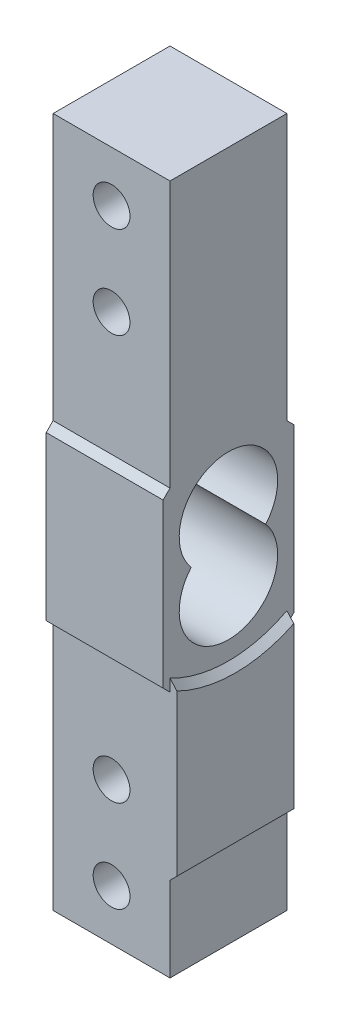
ISO-10303-21;
HEADER;
FILE_DESCRIPTION(('STEP AP214'),'2;1');
FILE_NAME('part.step','',(''),(''),'','','');
FILE_SCHEMA(('AUTOMOTIVE_DESIGN { 1 0 10303 214 1 1 1 1 }'));
ENDSEC;
DATA;
#1=APPLICATION_CONTEXT('core data for automotive mechanical design processes');
#2=APPLICATION_PROTOCOL_DEFINITION('international standard','automotive_design',2000,#1);
#3=PRODUCT_CONTEXT('',#1,'mechanical');
#4=PRODUCT('Part','Part','',(#3));
#5=PRODUCT_RELATED_PRODUCT_CATEGORY('part','',(#4));
#6=PRODUCT_DEFINITION_FORMATION('','',#4);
#7=PRODUCT_DEFINITION_CONTEXT('part definition',#1,'design');
#8=PRODUCT_DEFINITION('design','',#6,#7);
#9=PRODUCT_DEFINITION_SHAPE('','',#8);
#10=(LENGTH_UNIT() NAMED_UNIT(*) SI_UNIT(.MILLI.,.METRE.));
#11=(NAMED_UNIT(*) PLANE_ANGLE_UNIT() SI_UNIT($,.RADIAN.));
#12=(NAMED_UNIT(*) SI_UNIT($,.STERADIAN.) SOLID_ANGLE_UNIT());
#13=UNCERTAINTY_MEASURE_WITH_UNIT(LENGTH_MEASURE(1.E-05),#10,'distance_accuracy_value','');
#14=(GEOMETRIC_REPRESENTATION_CONTEXT(3) GLOBAL_UNCERTAINTY_ASSIGNED_CONTEXT((#13)) GLOBAL_UNIT_ASSIGNED_CONTEXT((#10,
#11,#12)) REPRESENTATION_CONTEXT('',''));
#15=CARTESIAN_POINT('',(0.,0.,0.));
#16=DIRECTION('',(0.,0.,1.));
#17=DIRECTION('',(1.,0.,0.));
#18=AXIS2_PLACEMENT_3D('',#15,#16,#17);
#19=CARTESIAN_POINT('',(6.35,37.5,6.35));
#20=DIRECTION('',(-1.,0.,0.));
#21=DIRECTION('',(0.,0.,1.));
#22=AXIS2_PLACEMENT_3D('',#19,#20,#21);
#23=PLANE('',#22);
#24=DIRECTION('',(0.,-1.,0.));
#25=VECTOR('',#24,1.);
#26=CARTESIAN_POINT('',(6.35,37.5,-6.35));
#27=LINE('',#26,#25);
#28=CARTESIAN_POINT('',(6.35,-28.3,-6.35));
#29=VERTEX_POINT('',#28);
#30=CARTESIAN_POINT('',(6.35,-37.5,-6.35));
#31=VERTEX_POINT('',#30);
#32=EDGE_CURVE('E220',#29,#31,#27,.T.);
#33=ORIENTED_EDGE('',*,*,#32,.F.);
#34=DIRECTION('',(0.,0.,1.));
#35=VECTOR('',#34,1.);
#36=CARTESIAN_POINT('',(6.35,-28.3,6.35));
#37=LINE('',#36,#35);
#38=CARTESIAN_POINT('',(6.35,-28.3,6.35));
#39=VERTEX_POINT('',#38);
#40=EDGE_CURVE('E276',#29,#39,#37,.T.);
#41=ORIENTED_EDGE('',*,*,#40,.T.);
#42=DIRECTION('',(0.,-1.,0.));
#43=VECTOR('',#42,1.);
#44=CARTESIAN_POINT('',(6.35,37.5,6.35));
#45=LINE('',#44,#43);
#46=CARTESIAN_POINT('',(6.35,-37.5,6.35));
#47=VERTEX_POINT('',#46);
#48=EDGE_CURVE('E200',#39,#47,#45,.T.);
#49=ORIENTED_EDGE('',*,*,#48,.T.);
#50=DIRECTION('',(0.,0.,-1.));
#51=VECTOR('',#50,1.);
#52=CARTESIAN_POINT('',(6.35,-37.5,6.35));
#53=LINE('',#52,#51);
#54=EDGE_CURVE('E169',#47,#31,#53,.T.);
#55=ORIENTED_EDGE('',*,*,#54,.T.);
#56=EDGE_LOOP('',(#33,#41,#49,#55));
#57=FACE_BOUND('',#56,.T.);
#58=ADVANCED_FACE('F35',(#57),#23,.F.);
#59=CARTESIAN_POINT('',(6.35,3.5,0.));
#60=DIRECTION('',(1.,0.,0.));
#61=DIRECTION('',(0.,0.,-1.));
#62=AXIS2_PLACEMENT_3D('',#59,#60,#61);
#63=CIRCLE('',#62,5.35);
#64=CARTESIAN_POINT('',(6.35,0.,-4.04629460123704));
#65=VERTEX_POINT('',#64);
#66=CARTESIAN_POINT('',(6.35,0.,4.04629460123705));
#67=VERTEX_POINT('',#66);
#68=EDGE_CURVE('E173',#65,#67,#63,.T.);
#69=ORIENTED_EDGE('',*,*,#68,.F.);
#70=CARTESIAN_POINT('',(6.35,-3.5,0.));
#71=DIRECTION('',(1.,0.,0.));
#72=DIRECTION('',(0.,0.,1.));
#73=AXIS2_PLACEMENT_3D('',#70,#71,#72);
#74=CIRCLE('',#73,5.35);
#75=EDGE_CURVE('E162',#67,#65,#74,.T.);
#76=ORIENTED_EDGE('',*,*,#75,.F.);
#77=EDGE_LOOP('',(#69,#76));
#78=FACE_BOUND('',#77,.T.);
#79=DIRECTION('',(0.,1.,0.));
#80=VECTOR('',#79,1.);
#81=CARTESIAN_POINT('',(6.35,-7.85000000000001,-6.35));
#82=LINE('',#81,#80);
#83=CARTESIAN_POINT('',(6.35,-10.6,-6.35));
#84=VERTEX_POINT('',#83);
#85=CARTESIAN_POINT('',(6.35,-9.28248998343714,-6.35));
#86=VERTEX_POINT('',#85);
#87=EDGE_CURVE('E222',#84,#86,#82,.T.);
#88=ORIENTED_EDGE('',*,*,#87,.F.);
#89=DIRECTION('',(0.,-0.707106781186551,0.707106781186544));
#90=VECTOR('',#89,1.);
#91=CARTESIAN_POINT('',(6.35,-9.84999999999997,-7.1));
#92=LINE('',#91,#90);
#93=CARTESIAN_POINT('',(6.35,-9.84999999999997,-7.1));
#94=VERTEX_POINT('',#93);
#95=EDGE_CURVE('E309',#84,#94,#92,.F.);
#96=ORIENTED_EDGE('',*,*,#95,.T.);
#97=DIRECTION('',(0.,-1.,0.));
#98=VECTOR('',#97,1.);
#99=CARTESIAN_POINT('',(6.35,37.5,-7.1));
#100=LINE('',#99,#98);
#101=CARTESIAN_POINT('',(6.35,7.84999999999999,-7.1));
#102=VERTEX_POINT('',#101);
#103=EDGE_CURVE('E179',#102,#94,#100,.T.);
#104=ORIENTED_EDGE('',*,*,#103,.F.);
#105=DIRECTION('',(0.,-0.707106781186544,-0.707106781186551));
#106=VECTOR('',#105,1.);
#107=CARTESIAN_POINT('',(6.35,9.85,-5.09999999999996));
#108=LINE('',#107,#106);
#109=CARTESIAN_POINT('',(6.35,8.59999999999998,-6.35));
#110=VERTEX_POINT('',#109);
#111=EDGE_CURVE('E307',#102,#110,#108,.F.);
#112=ORIENTED_EDGE('',*,*,#111,.T.);
#113=CARTESIAN_POINT('',(6.35,37.5,-6.35));
#114=VERTEX_POINT('',#113);
#115=EDGE_CURVE('E54',#114,#110,#27,.T.);
#116=ORIENTED_EDGE('',*,*,#115,.F.);
#117=DIRECTION('',(0.,0.,-1.));
#118=VECTOR('',#117,1.);
#119=CARTESIAN_POINT('',(6.35,37.5,6.35));
#120=LINE('',#119,#118);
#121=CARTESIAN_POINT('',(6.35,37.5,6.35));
#122=VERTEX_POINT('',#121);
#123=EDGE_CURVE('E190',#122,#114,#120,.T.);
#124=ORIENTED_EDGE('',*,*,#123,.F.);
#125=CARTESIAN_POINT('',(6.35,8.59999999999998,6.35));
#126=VERTEX_POINT('',#125);
#127=EDGE_CURVE('E211',#122,#126,#45,.T.);
#128=ORIENTED_EDGE('',*,*,#127,.T.);
#129=DIRECTION('',(0.,0.707106781186552,-0.707106781186544));
#130=VECTOR('',#129,1.);
#131=CARTESIAN_POINT('',(6.35,7.84999999999997,7.1));
#132=LINE('',#131,#130);
#133=CARTESIAN_POINT('',(6.35,7.84999999999997,7.1));
#134=VERTEX_POINT('',#133);
#135=EDGE_CURVE('E305',#126,#134,#132,.F.);
#136=ORIENTED_EDGE('',*,*,#135,.T.);
#137=DIRECTION('',(0.,1.,0.));
#138=VECTOR('',#137,1.);
#139=CARTESIAN_POINT('',(6.35,37.5,7.1));
#140=LINE('',#139,#138);
#141=CARTESIAN_POINT('',(6.35,-9.84999999999999,7.1));
#142=VERTEX_POINT('',#141);
#143=EDGE_CURVE('E360',#142,#134,#140,.T.);
#144=ORIENTED_EDGE('',*,*,#143,.F.);
#145=DIRECTION('',(0.,0.707106781186544,0.707106781186551));
#146=VECTOR('',#145,1.);
#147=CARTESIAN_POINT('',(6.35,-11.85,5.09999999999996));
#148=LINE('',#147,#146);
#149=CARTESIAN_POINT('',(6.35,-10.6,6.35));
#150=VERTEX_POINT('',#149);
#151=EDGE_CURVE('E303',#142,#150,#148,.F.);
#152=ORIENTED_EDGE('',*,*,#151,.T.);
#153=DIRECTION('',(0.,-1.,0.));
#154=VECTOR('',#153,1.);
#155=CARTESIAN_POINT('',(6.35,-7.85000000000001,6.35));
#156=LINE('',#155,#154);
#157=CARTESIAN_POINT('',(6.35,-9.28248998343714,6.34999999999999));
#158=VERTEX_POINT('',#157);
#159=EDGE_CURVE('E349',#158,#150,#156,.T.);
#160=ORIENTED_EDGE('',*,*,#159,.F.);
#161=CARTESIAN_POINT('',(6.35,2.79571428571428,0.));
#162=DIRECTION('',(-1.,0.,0.));
#163=DIRECTION('',(0.,0.,1.));
#164=AXIS2_PLACEMENT_3D('',#161,#162,#163);
#165=CIRCLE('',#164,13.6457142857143);
#166=EDGE_CURVE('E318',#158,#86,#165,.F.);
#167=ORIENTED_EDGE('',*,*,#166,.T.);
#168=EDGE_LOOP('',(#88,#96,#104,#112,#116,#124,#128,#136,#144,#152,#160,#167));
#169=FACE_BOUND('',#168,.T.);
#170=ADVANCED_FACE('F177',(#78,#169),#23,.F.);
#171=CARTESIAN_POINT('',(-6.35,37.5,6.35));
#172=DIRECTION('',(0.,0.,-1.));
#173=DIRECTION('',(-1.,0.,0.));
#174=AXIS2_PLACEMENT_3D('',#171,#172,#173);
#175=PLANE('',#174);
#176=CARTESIAN_POINT('',(0.,32.,6.35));
#177=DIRECTION('',(0.,0.,-1.));
#178=DIRECTION('',(-1.,0.,0.));
#179=AXIS2_PLACEMENT_3D('',#176,#177,#178);
#180=CIRCLE('',#179,2.);
#181=CARTESIAN_POINT('',(2.,32.,6.35));
#182=VERTEX_POINT('',#181);
#183=EDGE_CURVE('E346',#182,#182,#180,.T.);
#184=ORIENTED_EDGE('',*,*,#183,.T.);
#185=EDGE_LOOP('',(#184));
#186=FACE_BOUND('',#185,.T.);
#187=CARTESIAN_POINT('',(0.,22.,6.35));
#188=DIRECTION('',(0.,0.,-1.));
#189=DIRECTION('',(-1.,0.,0.));
#190=AXIS2_PLACEMENT_3D('',#187,#188,#189);
#191=CIRCLE('',#190,2.);
#192=CARTESIAN_POINT('',(2.,22.,6.35));
#193=VERTEX_POINT('',#192);
#194=EDGE_CURVE('E335',#193,#193,#191,.T.);
#195=ORIENTED_EDGE('',*,*,#194,.T.);
#196=EDGE_LOOP('',(#195));
#197=FACE_BOUND('',#196,.T.);
#198=DIRECTION('',(0.,-1.,0.));
#199=VECTOR('',#198,1.);
#200=CARTESIAN_POINT('',(-6.35,37.5,6.35));
#201=LINE('',#200,#199);
#202=CARTESIAN_POINT('',(-6.35,37.5,6.35));
#203=VERTEX_POINT('',#202);
#204=CARTESIAN_POINT('',(-6.35,8.59999999999998,6.35));
#205=VERTEX_POINT('',#204);
#206=EDGE_CURVE('E214',#203,#205,#201,.T.);
#207=ORIENTED_EDGE('',*,*,#206,.T.);
#208=DIRECTION('',(-1.,0.,0.));
#209=VECTOR('',#208,1.);
#210=CARTESIAN_POINT('',(-6.35,8.59999999999998,6.35));
#211=LINE('',#210,#209);
#212=EDGE_CURVE('E46',#205,#126,#211,.F.);
#213=ORIENTED_EDGE('',*,*,#212,.T.);
#214=ORIENTED_EDGE('',*,*,#127,.F.);
#215=DIRECTION('',(1.,0.,0.));
#216=VECTOR('',#215,1.);
#217=CARTESIAN_POINT('',(-6.35,37.5,6.35));
#218=LINE('',#217,#216);
#219=EDGE_CURVE('E198',#203,#122,#218,.T.);
#220=ORIENTED_EDGE('',*,*,#219,.F.);
#221=EDGE_LOOP('',(#207,#213,#214,#220));
#222=FACE_BOUND('',#221,.T.);
#223=ADVANCED_FACE('F405',(#186,#197,#222),#175,.F.);
#224=CARTESIAN_POINT('',(-6.35,37.5,-6.35));
#225=DIRECTION('',(0.,0.,1.));
#226=DIRECTION('',(1.,0.,0.));
#227=AXIS2_PLACEMENT_3D('',#224,#225,#226);
#228=PLANE('',#227);
#229=CARTESIAN_POINT('',(0.,-22.,-6.35));
#230=DIRECTION('',(0.,0.,1.));
#231=DIRECTION('',(1.,0.,0.));
#232=AXIS2_PLACEMENT_3D('',#229,#230,#231);
#233=CIRCLE('',#232,2.);
#234=CARTESIAN_POINT('',(2.,-22.,-6.35));
#235=VERTEX_POINT('',#234);
#236=EDGE_CURVE('E332',#235,#235,#233,.T.);
#237=ORIENTED_EDGE('',*,*,#236,.T.);
#238=EDGE_LOOP('',(#237));
#239=FACE_BOUND('',#238,.T.);
#240=CARTESIAN_POINT('',(0.,-32.,-6.35));
#241=DIRECTION('',(0.,0.,1.));
#242=DIRECTION('',(1.,0.,0.));
#243=AXIS2_PLACEMENT_3D('',#240,#241,#242);
#244=CIRCLE('',#243,2.);
#245=CARTESIAN_POINT('',(2.,-32.,-6.35));
#246=VERTEX_POINT('',#245);
#247=EDGE_CURVE('E329',#246,#246,#244,.T.);
#248=ORIENTED_EDGE('',*,*,#247,.T.);
#249=EDGE_LOOP('',(#248));
#250=FACE_BOUND('',#249,.T.);
#251=DIRECTION('',(-0.707106781186544,-0.707106781186551,0.));
#252=VECTOR('',#251,1.);
#253=CARTESIAN_POINT('',(7.1,-27.55,-6.35));
#254=LINE('',#253,#252);
#255=CARTESIAN_POINT('',(7.1,-27.55,-6.35));
#256=VERTEX_POINT('',#255);
#257=EDGE_CURVE('E237',#256,#29,#254,.T.);
#258=ORIENTED_EDGE('',*,*,#257,.T.);
#259=ORIENTED_EDGE('',*,*,#32,.T.);
#260=DIRECTION('',(-1.,0.,0.));
#261=VECTOR('',#260,1.);
#262=CARTESIAN_POINT('',(-6.35,-37.5,-6.35));
#263=LINE('',#262,#261);
#264=CARTESIAN_POINT('',(-6.35,-37.5,-6.35));
#265=VERTEX_POINT('',#264);
#266=EDGE_CURVE('E203',#31,#265,#263,.T.);
#267=ORIENTED_EDGE('',*,*,#266,.T.);
#268=DIRECTION('',(0.,-1.,0.));
#269=VECTOR('',#268,1.);
#270=CARTESIAN_POINT('',(-6.35,37.5,-6.35));
#271=LINE('',#270,#269);
#272=CARTESIAN_POINT('',(-6.35,-10.6,-6.35));
#273=VERTEX_POINT('',#272);
#274=EDGE_CURVE('E217',#273,#265,#271,.T.);
#275=ORIENTED_EDGE('',*,*,#274,.F.);
#276=DIRECTION('',(-1.,0.,0.));
#277=VECTOR('',#276,1.);
#278=CARTESIAN_POINT('',(-6.35,-10.6,-6.35));
#279=LINE('',#278,#277);
#280=EDGE_CURVE('E320',#273,#84,#279,.F.);
#281=ORIENTED_EDGE('',*,*,#280,.T.);
#282=ORIENTED_EDGE('',*,*,#87,.T.);
#283=CARTESIAN_POINT('',(6.35,-9.28248998343714,-6.35));
#284=CARTESIAN_POINT('',(6.47451875053997,-9.42313890329156,-6.35));
#285=CARTESIAN_POINT('',(6.59927813075226,-9.56357331213953,-6.35));
#286=CARTESIAN_POINT('',(6.84927813082808,-9.84401308573139,-6.35));
#287=CARTESIAN_POINT('',(6.9745187506158,-9.98401845054286,-6.35));
#288=CARTESIAN_POINT('',(7.1,-10.1238093044155,-6.35));
#289=B_SPLINE_CURVE_WITH_KNOTS('',3,(#283,#284,#285,#286,#287,#288),.UNSPECIFIED.,.F.,.F.,(4,2,
4),(0.,0.563542842430718,1.12708559607701),.UNSPECIFIED.);
#290=CARTESIAN_POINT('',(7.1,-10.1238093044155,-6.35));
#291=VERTEX_POINT('',#290);
#292=EDGE_CURVE('E229',#86,#291,#289,.T.);
#293=ORIENTED_EDGE('',*,*,#292,.T.);
#294=DIRECTION('',(0.,1.,0.));
#295=VECTOR('',#294,1.);
#296=CARTESIAN_POINT('',(7.1,-7.85000000000001,-6.35));
#297=LINE('',#296,#295);
#298=EDGE_CURVE('E352',#256,#291,#297,.T.);
#299=ORIENTED_EDGE('',*,*,#298,.F.);
#300=EDGE_LOOP('',(#258,#259,#267,#275,#281,#282,#293,#299));
#301=FACE_BOUND('',#300,.T.);
#302=ADVANCED_FACE('F250',(#239,#250,#301),#228,.F.);
#303=CARTESIAN_POINT('',(0.,32.,-6.35));
#304=DIRECTION('',(0.,0.,1.));
#305=DIRECTION('',(1.,0.,0.));
#306=AXIS2_PLACEMENT_3D('',#303,#304,#305);
#307=CIRCLE('',#306,2.);
#308=CARTESIAN_POINT('',(2.,32.,-6.35));
#309=VERTEX_POINT('',#308);
#310=EDGE_CURVE('E40',#309,#309,#307,.T.);
#311=ORIENTED_EDGE('',*,*,#310,.T.);
#312=EDGE_LOOP('',(#311));
#313=FACE_BOUND('',#312,.T.);
#314=CARTESIAN_POINT('',(0.,22.,-6.35));
#315=DIRECTION('',(0.,0.,1.));
#316=DIRECTION('',(1.,0.,0.));
#317=AXIS2_PLACEMENT_3D('',#314,#315,#316);
#318=CIRCLE('',#317,2.);
#319=CARTESIAN_POINT('',(2.,22.,-6.35));
#320=VERTEX_POINT('',#319);
#321=EDGE_CURVE('E333',#320,#320,#318,.T.);
#322=ORIENTED_EDGE('',*,*,#321,.T.);
#323=EDGE_LOOP('',(#322));
#324=FACE_BOUND('',#323,.T.);
#325=ORIENTED_EDGE('',*,*,#115,.T.);
#326=DIRECTION('',(1.,0.,0.));
#327=VECTOR('',#326,1.);
#328=CARTESIAN_POINT('',(-6.35,8.59999999999998,-6.35));
#329=LINE('',#328,#327);
#330=CARTESIAN_POINT('',(-6.35,8.59999999999998,-6.35));
#331=VERTEX_POINT('',#330);
#332=EDGE_CURVE('E322',#110,#331,#329,.F.);
#333=ORIENTED_EDGE('',*,*,#332,.T.);
#334=CARTESIAN_POINT('',(-6.35,37.5,-6.35));
#335=VERTEX_POINT('',#334);
#336=EDGE_CURVE('E218',#335,#331,#271,.T.);
#337=ORIENTED_EDGE('',*,*,#336,.F.);
#338=DIRECTION('',(-1.,0.,0.));
#339=VECTOR('',#338,1.);
#340=CARTESIAN_POINT('',(-6.35,37.5,-6.35));
#341=LINE('',#340,#339);
#342=EDGE_CURVE('E193',#114,#335,#341,.T.);
#343=ORIENTED_EDGE('',*,*,#342,.F.);
#344=EDGE_LOOP('',(#325,#333,#337,#343));
#345=FACE_BOUND('',#344,.T.);
#346=ADVANCED_FACE('F244',(#313,#324,#345),#228,.F.);
#347=CARTESIAN_POINT('',(-6.35,37.5,6.35));
#348=DIRECTION('',(1.,0.,0.));
#349=DIRECTION('',(0.,0.,-1.));
#350=AXIS2_PLACEMENT_3D('',#347,#348,#349);
#351=PLANE('',#350);
#352=CARTESIAN_POINT('',(-6.35,3.5,0.));
#353=DIRECTION('',(1.,0.,0.));
#354=DIRECTION('',(0.,0.,-1.));
#355=AXIS2_PLACEMENT_3D('',#352,#353,#354);
#356=CIRCLE('',#355,5.35);
#357=CARTESIAN_POINT('',(-6.35,0.,-4.04629460123704));
#358=VERTEX_POINT('',#357);
#359=CARTESIAN_POINT('',(-6.35,0.,4.04629460123705));
#360=VERTEX_POINT('',#359);
#361=EDGE_CURVE('E187',#358,#360,#356,.T.);
#362=ORIENTED_EDGE('',*,*,#361,.T.);
#363=CARTESIAN_POINT('',(-6.35,-3.5,0.));
#364=DIRECTION('',(1.,0.,0.));
#365=DIRECTION('',(0.,0.,1.));
#366=AXIS2_PLACEMENT_3D('',#363,#364,#365);
#367=CIRCLE('',#366,5.35);
#368=EDGE_CURVE('E165',#360,#358,#367,.T.);
#369=ORIENTED_EDGE('',*,*,#368,.T.);
#370=EDGE_LOOP('',(#362,#369));
#371=FACE_BOUND('',#370,.T.);
#372=DIRECTION('',(0.,0.707106781186551,-0.707106781186544));
#373=VECTOR('',#372,1.);
#374=CARTESIAN_POINT('',(-6.35,-9.84999999999997,-7.1));
#375=LINE('',#374,#373);
#376=CARTESIAN_POINT('',(-6.35,-9.84999999999997,-7.1));
#377=VERTEX_POINT('',#376);
#378=EDGE_CURVE('E300',#377,#273,#375,.F.);
#379=ORIENTED_EDGE('',*,*,#378,.T.);
#380=ORIENTED_EDGE('',*,*,#274,.T.);
#381=DIRECTION('',(0.,0.,1.));
#382=VECTOR('',#381,1.);
#383=CARTESIAN_POINT('',(-6.35,-37.5,6.35));
#384=LINE('',#383,#382);
#385=CARTESIAN_POINT('',(-6.35,-37.5,6.35));
#386=VERTEX_POINT('',#385);
#387=EDGE_CURVE('E206',#265,#386,#384,.T.);
#388=ORIENTED_EDGE('',*,*,#387,.T.);
#389=CARTESIAN_POINT('',(-6.35,-10.6,6.35));
#390=VERTEX_POINT('',#389);
#391=EDGE_CURVE('E213',#390,#386,#201,.T.);
#392=ORIENTED_EDGE('',*,*,#391,.F.);
#393=DIRECTION('',(0.,-0.707106781186544,-0.707106781186551));
#394=VECTOR('',#393,1.);
#395=CARTESIAN_POINT('',(-6.35,-11.85,5.09999999999996));
#396=LINE('',#395,#394);
#397=CARTESIAN_POINT('',(-6.35,-9.84999999999999,7.1));
#398=VERTEX_POINT('',#397);
#399=EDGE_CURVE('E293',#390,#398,#396,.F.);
#400=ORIENTED_EDGE('',*,*,#399,.T.);
#401=DIRECTION('',(0.,-1.,0.));
#402=VECTOR('',#401,1.);
#403=CARTESIAN_POINT('',(-6.35,37.5,7.1));
#404=LINE('',#403,#402);
#405=CARTESIAN_POINT('',(-6.35,7.84999999999997,7.1));
#406=VERTEX_POINT('',#405);
#407=EDGE_CURVE('E355',#406,#398,#404,.T.);
#408=ORIENTED_EDGE('',*,*,#407,.F.);
#409=DIRECTION('',(0.,-0.707106781186552,0.707106781186544));
#410=VECTOR('',#409,1.);
#411=CARTESIAN_POINT('',(-6.35,7.84999999999997,7.1));
#412=LINE('',#411,#410);
#413=EDGE_CURVE('E295',#406,#205,#412,.F.);
#414=ORIENTED_EDGE('',*,*,#413,.T.);
#415=ORIENTED_EDGE('',*,*,#206,.F.);
#416=DIRECTION('',(0.,0.,1.));
#417=VECTOR('',#416,1.);
#418=CARTESIAN_POINT('',(-6.35,37.5,6.35));
#419=LINE('',#418,#417);
#420=EDGE_CURVE('E196',#335,#203,#419,.T.);
#421=ORIENTED_EDGE('',*,*,#420,.F.);
#422=ORIENTED_EDGE('',*,*,#336,.T.);
#423=DIRECTION('',(0.,0.707106781186544,0.707106781186551));
#424=VECTOR('',#423,1.);
#425=CARTESIAN_POINT('',(-6.35,9.85,-5.09999999999996));
#426=LINE('',#425,#424);
#427=CARTESIAN_POINT('',(-6.35,7.84999999999999,-7.1));
#428=VERTEX_POINT('',#427);
#429=EDGE_CURVE('E298',#331,#428,#426,.F.);
#430=ORIENTED_EDGE('',*,*,#429,.T.);
#431=DIRECTION('',(0.,1.,0.));
#432=VECTOR('',#431,1.);
#433=CARTESIAN_POINT('',(-6.35,37.5,-7.1));
#434=LINE('',#433,#432);
#435=EDGE_CURVE('E182',#377,#428,#434,.T.);
#436=ORIENTED_EDGE('',*,*,#435,.F.);
#437=EDGE_LOOP('',(#379,#380,#388,#392,#400,#408,#414,#415,#421,#422,#430,#436));
#438=FACE_BOUND('',#437,.T.);
#439=ADVANCED_FACE('F249',(#371,#438),#351,.F.);
#440=CARTESIAN_POINT('',(0.,-22.,6.35));
#441=DIRECTION('',(0.,0.,-1.));
#442=DIRECTION('',(-1.,0.,0.));
#443=AXIS2_PLACEMENT_3D('',#440,#441,#442);
#444=CIRCLE('',#443,2.);
#445=CARTESIAN_POINT('',(2.,-22.,6.35));
#446=VERTEX_POINT('',#445);
#447=EDGE_CURVE('E330',#446,#446,#444,.T.);
#448=ORIENTED_EDGE('',*,*,#447,.T.);
#449=EDGE_LOOP('',(#448));
#450=FACE_BOUND('',#449,.T.);
#451=CARTESIAN_POINT('',(0.,-32.,6.35));
#452=DIRECTION('',(0.,0.,-1.));
#453=DIRECTION('',(-1.,0.,0.));
#454=AXIS2_PLACEMENT_3D('',#451,#452,#453);
#455=CIRCLE('',#454,2.);
#456=CARTESIAN_POINT('',(2.,-32.,6.35));
#457=VERTEX_POINT('',#456);
#458=EDGE_CURVE('E326',#457,#457,#455,.T.);
#459=ORIENTED_EDGE('',*,*,#458,.T.);
#460=EDGE_LOOP('',(#459));
#461=FACE_BOUND('',#460,.T.);
#462=ORIENTED_EDGE('',*,*,#48,.F.);
#463=DIRECTION('',(0.707106781186544,0.707106781186551,0.));
#464=VECTOR('',#463,1.);
#465=CARTESIAN_POINT('',(7.1,-27.55,6.35));
#466=LINE('',#465,#464);
#467=CARTESIAN_POINT('',(7.1,-27.55,6.34999999999999));
#468=VERTEX_POINT('',#467);
#469=EDGE_CURVE('E274',#39,#468,#466,.T.);
#470=ORIENTED_EDGE('',*,*,#469,.T.);
#471=DIRECTION('',(0.,-1.,0.));
#472=VECTOR('',#471,1.);
#473=CARTESIAN_POINT('',(7.1,-7.85000000000001,6.35));
#474=LINE('',#473,#472);
#475=CARTESIAN_POINT('',(7.1,-10.1238093044155,6.35));
#476=VERTEX_POINT('',#475);
#477=EDGE_CURVE('E350',#476,#468,#474,.T.);
#478=ORIENTED_EDGE('',*,*,#477,.F.);
#479=CARTESIAN_POINT('',(7.1,-10.1238093044155,6.34999999999999));
#480=CARTESIAN_POINT('',(6.9745187506158,-9.98401845054286,6.35));
#481=CARTESIAN_POINT('',(6.84927813082808,-9.84401308573139,6.35));
#482=CARTESIAN_POINT('',(6.59927813075226,-9.56357331213953,6.35));
#483=CARTESIAN_POINT('',(6.47451875053998,-9.42313890329156,6.35));
#484=CARTESIAN_POINT('',(6.35,-9.28248998343714,6.35));
#485=B_SPLINE_CURVE_WITH_KNOTS('',3,(#479,#480,#481,#482,#483,#484),.UNSPECIFIED.,.F.,.F.,(4,2,
4),(0.,0.563542753646293,1.12708559607701),.UNSPECIFIED.);
#486=EDGE_CURVE('E281',#476,#158,#485,.T.);
#487=ORIENTED_EDGE('',*,*,#486,.T.);
#488=ORIENTED_EDGE('',*,*,#159,.T.);
#489=DIRECTION('',(1.,0.,0.));
#490=VECTOR('',#489,1.);
#491=CARTESIAN_POINT('',(-6.35,-10.6,6.35));
#492=LINE('',#491,#490);
#493=EDGE_CURVE('E11',#150,#390,#492,.F.);
#494=ORIENTED_EDGE('',*,*,#493,.T.);
#495=ORIENTED_EDGE('',*,*,#391,.T.);
#496=DIRECTION('',(1.,0.,0.));
#497=VECTOR('',#496,1.);
#498=CARTESIAN_POINT('',(-6.35,-37.5,6.35));
#499=LINE('',#498,#497);
#500=EDGE_CURVE('E194',#386,#47,#499,.T.);
#501=ORIENTED_EDGE('',*,*,#500,.T.);
#502=EDGE_LOOP('',(#462,#470,#478,#487,#488,#494,#495,#501));
#503=FACE_BOUND('',#502,.T.);
#504=ADVANCED_FACE('F376',(#450,#461,#503),#175,.F.);
#505=CARTESIAN_POINT('',(0.,37.5,0.));
#506=DIRECTION('',(0.,-1.,0.));
#507=DIRECTION('',(0.,0.,-1.));
#508=AXIS2_PLACEMENT_3D('',#505,#506,#507);
#509=PLANE('',#508);
#510=ORIENTED_EDGE('',*,*,#123,.T.);
#511=ORIENTED_EDGE('',*,*,#342,.T.);
#512=ORIENTED_EDGE('',*,*,#420,.T.);
#513=ORIENTED_EDGE('',*,*,#219,.T.);
#514=EDGE_LOOP('',(#510,#511,#512,#513));
#515=FACE_BOUND('',#514,.T.);
#516=ADVANCED_FACE('F401',(#515),#509,.F.);
#517=CARTESIAN_POINT('',(0.,-37.5,0.));
#518=DIRECTION('',(0.,-1.,0.));
#519=DIRECTION('',(0.,0.,-1.));
#520=AXIS2_PLACEMENT_3D('',#517,#518,#519);
#521=PLANE('',#520);
#522=ORIENTED_EDGE('',*,*,#54,.F.);
#523=ORIENTED_EDGE('',*,*,#500,.F.);
#524=ORIENTED_EDGE('',*,*,#387,.F.);
#525=ORIENTED_EDGE('',*,*,#266,.F.);
#526=EDGE_LOOP('',(#522,#523,#524,#525));
#527=FACE_BOUND('',#526,.T.);
#528=ADVANCED_FACE('F537',(#527),#521,.T.);
#529=CARTESIAN_POINT('',(-6.35,-3.5,0.));
#530=DIRECTION('',(1.,0.,0.));
#531=DIRECTION('',(0.,0.,-1.));
#532=AXIS2_PLACEMENT_3D('',#529,#530,#531);
#533=CYLINDRICAL_SURFACE('',#532,5.35);
#534=DIRECTION('',(1.,0.,0.));
#535=VECTOR('',#534,1.);
#536=CARTESIAN_POINT('',(-6.35,0.,-4.04629460123704));
#537=LINE('',#536,#535);
#538=EDGE_CURVE('E170',#358,#65,#537,.T.);
#539=ORIENTED_EDGE('',*,*,#538,.F.);
#540=ORIENTED_EDGE('',*,*,#368,.F.);
#541=DIRECTION('',(1.,0.,0.));
#542=VECTOR('',#541,1.);
#543=CARTESIAN_POINT('',(-6.35,0.,4.04629460123705));
#544=LINE('',#543,#542);
#545=EDGE_CURVE('E158',#360,#67,#544,.T.);
#546=ORIENTED_EDGE('',*,*,#545,.T.);
#547=ORIENTED_EDGE('',*,*,#75,.T.);
#548=EDGE_LOOP('',(#539,#540,#546,#547));
#549=FACE_BOUND('',#548,.T.);
#550=ADVANCED_FACE('F160',(#549),#533,.F.);
#551=CARTESIAN_POINT('',(-6.35,3.5,0.));
#552=DIRECTION('',(1.,0.,0.));
#553=DIRECTION('',(0.,0.,-1.));
#554=AXIS2_PLACEMENT_3D('',#551,#552,#553);
#555=CYLINDRICAL_SURFACE('',#554,5.35);
#556=ORIENTED_EDGE('',*,*,#545,.F.);
#557=ORIENTED_EDGE('',*,*,#361,.F.);
#558=ORIENTED_EDGE('',*,*,#538,.T.);
#559=ORIENTED_EDGE('',*,*,#68,.T.);
#560=EDGE_LOOP('',(#556,#557,#558,#559));
#561=FACE_BOUND('',#560,.T.);
#562=ADVANCED_FACE('F174',(#561),#555,.F.);
#563=CARTESIAN_POINT('',(28.0629569612248,37.5,-7.1));
#564=DIRECTION('',(0.,0.,1.));
#565=DIRECTION('',(0.,-1.,0.));
#566=AXIS2_PLACEMENT_3D('',#563,#564,#565);
#567=PLANE('',#566);
#568=ORIENTED_EDGE('',*,*,#103,.T.);
#569=DIRECTION('',(-1.,0.,0.));
#570=VECTOR('',#569,1.);
#571=CARTESIAN_POINT('',(28.0629569612248,-9.84999999999997,-7.1));
#572=LINE('',#571,#570);
#573=EDGE_CURVE('E284',#94,#377,#572,.T.);
#574=ORIENTED_EDGE('',*,*,#573,.T.);
#575=ORIENTED_EDGE('',*,*,#435,.T.);
#576=DIRECTION('',(1.,0.,0.));
#577=VECTOR('',#576,1.);
#578=CARTESIAN_POINT('',(28.0629569612248,7.84999999999999,-7.1));
#579=LINE('',#578,#577);
#580=EDGE_CURVE('E280',#428,#102,#579,.T.);
#581=ORIENTED_EDGE('',*,*,#580,.T.);
#582=EDGE_LOOP('',(#568,#574,#575,#581));
#583=FACE_BOUND('',#582,.T.);
#584=ADVANCED_FACE('F390',(#583),#567,.F.);
#585=CARTESIAN_POINT('',(28.0629569612248,37.5,7.1));
#586=DIRECTION('',(0.,0.,-1.));
#587=DIRECTION('',(0.,1.,0.));
#588=AXIS2_PLACEMENT_3D('',#585,#586,#587);
#589=PLANE('',#588);
#590=ORIENTED_EDGE('',*,*,#143,.T.);
#591=DIRECTION('',(-1.,0.,0.));
#592=VECTOR('',#591,1.);
#593=CARTESIAN_POINT('',(28.0629569612248,7.84999999999997,7.1));
#594=LINE('',#593,#592);
#595=EDGE_CURVE('E314',#134,#406,#594,.T.);
#596=ORIENTED_EDGE('',*,*,#595,.T.);
#597=ORIENTED_EDGE('',*,*,#407,.T.);
#598=DIRECTION('',(1.,0.,0.));
#599=VECTOR('',#598,1.);
#600=CARTESIAN_POINT('',(28.0629569612248,-9.84999999999999,7.1));
#601=LINE('',#600,#599);
#602=EDGE_CURVE('E311',#398,#142,#601,.T.);
#603=ORIENTED_EDGE('',*,*,#602,.T.);
#604=EDGE_LOOP('',(#590,#596,#597,#603));
#605=FACE_BOUND('',#604,.T.);
#606=ADVANCED_FACE('F268',(#605),#589,.F.);
#607=CARTESIAN_POINT('',(7.1,2.79571428571428,0.));
#608=DIRECTION('',(1.,0.,0.));
#609=DIRECTION('',(0.,0.,-1.));
#610=AXIS2_PLACEMENT_3D('',#607,#608,#609);
#611=PLANE('',#610);
#612=ORIENTED_EDGE('',*,*,#477,.T.);
#613=DIRECTION('',(0.,0.,-1.));
#614=VECTOR('',#613,1.);
#615=CARTESIAN_POINT('',(7.1,-27.55,-6.35));
#616=LINE('',#615,#614);
#617=EDGE_CURVE('E226',#468,#256,#616,.T.);
#618=ORIENTED_EDGE('',*,*,#617,.T.);
#619=ORIENTED_EDGE('',*,*,#298,.T.);
#620=CARTESIAN_POINT('',(7.1,2.79571428571428,0.));
#621=DIRECTION('',(1.,0.,0.));
#622=DIRECTION('',(0.,0.,-1.));
#623=AXIS2_PLACEMENT_3D('',#620,#621,#622);
#624=CIRCLE('',#623,14.3957142857143);
#625=EDGE_CURVE('E223',#291,#476,#624,.F.);
#626=ORIENTED_EDGE('',*,*,#625,.T.);
#627=EDGE_LOOP('',(#612,#618,#619,#626));
#628=FACE_BOUND('',#627,.T.);
#629=ADVANCED_FACE('F260',(#628),#611,.T.);
#630=CARTESIAN_POINT('',(7.1,-27.55,0.));
#631=DIRECTION('',(0.707106781186551,-0.707106781186544,0.));
#632=DIRECTION('',(0.,0.,1.));
#633=AXIS2_PLACEMENT_3D('',#630,#631,#632);
#634=PLANE('',#633);
#635=ORIENTED_EDGE('',*,*,#469,.F.);
#636=ORIENTED_EDGE('',*,*,#40,.F.);
#637=ORIENTED_EDGE('',*,*,#257,.F.);
#638=ORIENTED_EDGE('',*,*,#617,.F.);
#639=EDGE_LOOP('',(#635,#636,#637,#638));
#640=FACE_BOUND('',#639,.T.);
#641=ADVANCED_FACE('F256',(#640),#634,.T.);
#642=CARTESIAN_POINT('',(7.1,2.79571428571428,0.));
#643=DIRECTION('',(1.,0.,0.));
#644=DIRECTION('',(0.,0.,-1.));
#645=AXIS2_PLACEMENT_3D('',#642,#643,#644);
#646=CONICAL_SURFACE('',#645,14.3957142857143,0.785398163397453);
#647=ORIENTED_EDGE('',*,*,#292,.F.);
#648=ORIENTED_EDGE('',*,*,#166,.F.);
#649=ORIENTED_EDGE('',*,*,#486,.F.);
#650=ORIENTED_EDGE('',*,*,#625,.F.);
#651=EDGE_LOOP('',(#647,#648,#649,#650));
#652=FACE_BOUND('',#651,.T.);
#653=ADVANCED_FACE('F240',(#652),#646,.F.);
#654=CARTESIAN_POINT('',(28.0629569612248,-9.84999999999997,-7.1));
#655=DIRECTION('',(0.,0.707106781186544,0.707106781186551));
#656=DIRECTION('',(-1.,0.,0.));
#657=AXIS2_PLACEMENT_3D('',#654,#655,#656);
#658=PLANE('',#657);
#659=ORIENTED_EDGE('',*,*,#95,.F.);
#660=ORIENTED_EDGE('',*,*,#280,.F.);
#661=ORIENTED_EDGE('',*,*,#378,.F.);
#662=ORIENTED_EDGE('',*,*,#573,.F.);
#663=EDGE_LOOP('',(#659,#660,#661,#662));
#664=FACE_BOUND('',#663,.T.);
#665=ADVANCED_FACE('F266',(#664),#658,.F.);
#666=CARTESIAN_POINT('',(28.0629569612248,9.85,-5.09999999999996));
#667=DIRECTION('',(0.,-0.707106781186551,0.707106781186544));
#668=DIRECTION('',(-1.,0.,0.));
#669=AXIS2_PLACEMENT_3D('',#666,#667,#668);
#670=PLANE('',#669);
#671=ORIENTED_EDGE('',*,*,#111,.F.);
#672=ORIENTED_EDGE('',*,*,#580,.F.);
#673=ORIENTED_EDGE('',*,*,#429,.F.);
#674=ORIENTED_EDGE('',*,*,#332,.F.);
#675=EDGE_LOOP('',(#671,#672,#673,#674));
#676=FACE_BOUND('',#675,.T.);
#677=ADVANCED_FACE('F397',(#676),#670,.F.);
#678=CARTESIAN_POINT('',(28.0629569612248,7.84999999999997,7.1));
#679=DIRECTION('',(0.,-0.707106781186544,-0.707106781186552));
#680=DIRECTION('',(-1.,0.,0.));
#681=AXIS2_PLACEMENT_3D('',#678,#679,#680);
#682=PLANE('',#681);
#683=ORIENTED_EDGE('',*,*,#135,.F.);
#684=ORIENTED_EDGE('',*,*,#212,.F.);
#685=ORIENTED_EDGE('',*,*,#413,.F.);
#686=ORIENTED_EDGE('',*,*,#595,.F.);
#687=EDGE_LOOP('',(#683,#684,#685,#686));
#688=FACE_BOUND('',#687,.T.);
#689=ADVANCED_FACE('F409',(#688),#682,.F.);
#690=CARTESIAN_POINT('',(28.0629569612248,-11.85,5.09999999999996));
#691=DIRECTION('',(0.,0.707106781186551,-0.707106781186544));
#692=DIRECTION('',(-1.,0.,0.));
#693=AXIS2_PLACEMENT_3D('',#690,#691,#692);
#694=PLANE('',#693);
#695=ORIENTED_EDGE('',*,*,#151,.F.);
#696=ORIENTED_EDGE('',*,*,#602,.F.);
#697=ORIENTED_EDGE('',*,*,#399,.F.);
#698=ORIENTED_EDGE('',*,*,#493,.F.);
#699=EDGE_LOOP('',(#695,#696,#697,#698));
#700=FACE_BOUND('',#699,.T.);
#701=ADVANCED_FACE('F38',(#700),#694,.F.);
#702=CARTESIAN_POINT('',(0.,-32.,-7.1));
#703=DIRECTION('',(0.,0.,1.));
#704=DIRECTION('',(1.,0.,0.));
#705=AXIS2_PLACEMENT_3D('',#702,#703,#704);
#706=CYLINDRICAL_SURFACE('',#705,2.);
#707=CARTESIAN_POINT('',(2.,-32.,6.35));
#708=CARTESIAN_POINT('',(2.,-32.,6.21770833333333));
#709=CARTESIAN_POINT('',(2.,-32.,6.08541666666667));
#710=CARTESIAN_POINT('',(2.,-32.,5.82083333333333));
#711=CARTESIAN_POINT('',(2.,-32.,5.68854166666667));
#712=CARTESIAN_POINT('',(2.,-32.,5.42395833333333));
#713=CARTESIAN_POINT('',(2.,-32.,5.29166666666667));
#714=CARTESIAN_POINT('',(2.,-32.,5.02708333333333));
#715=CARTESIAN_POINT('',(2.,-32.,4.89479166666667));
#716=CARTESIAN_POINT('',(2.,-32.,4.63020833333333));
#717=CARTESIAN_POINT('',(2.,-32.,4.49791666666667));
#718=CARTESIAN_POINT('',(2.,-32.,4.23333333333333));
#719=CARTESIAN_POINT('',(2.,-32.,4.10104166666667));
#720=CARTESIAN_POINT('',(2.,-32.,3.83645833333333));
#721=CARTESIAN_POINT('',(2.,-32.,3.70416666666667));
#722=CARTESIAN_POINT('',(2.,-32.,3.43958333333333));
#723=CARTESIAN_POINT('',(2.,-32.,3.30729166666667));
#724=CARTESIAN_POINT('',(2.,-32.,3.04270833333333));
#725=CARTESIAN_POINT('',(2.,-32.,2.91041666666667));
#726=CARTESIAN_POINT('',(2.,-32.,2.64583333333333));
#727=CARTESIAN_POINT('',(2.,-32.,2.51354166666667));
#728=CARTESIAN_POINT('',(2.,-32.,2.24895833333333));
#729=CARTESIAN_POINT('',(2.,-32.,2.11666666666667));
#730=CARTESIAN_POINT('',(2.,-32.,1.85208333333333));
#731=CARTESIAN_POINT('',(2.,-32.,1.71979166666667));
#732=CARTESIAN_POINT('',(2.,-32.,1.45520833333333));
#733=CARTESIAN_POINT('',(2.,-32.,1.32291666666667));
#734=CARTESIAN_POINT('',(2.,-32.,1.05833333333333));
#735=CARTESIAN_POINT('',(2.,-32.,0.926041666666666));
#736=CARTESIAN_POINT('',(2.,-32.,0.661458333333332));
#737=CARTESIAN_POINT('',(2.,-32.,0.529166666666666));
#738=CARTESIAN_POINT('',(2.,-32.,0.264583333333333));
#739=CARTESIAN_POINT('',(2.,-32.,0.132291666666667));
#740=CARTESIAN_POINT('',(2.,-32.,-0.132291666666667));
#741=CARTESIAN_POINT('',(2.,-32.,-0.264583333333333));
#742=CARTESIAN_POINT('',(2.,-32.,-0.529166666666666));
#743=CARTESIAN_POINT('',(2.,-32.,-0.661458333333333));
#744=CARTESIAN_POINT('',(2.,-32.,-0.926041666666667));
#745=CARTESIAN_POINT('',(2.,-32.,-1.05833333333333));
#746=CARTESIAN_POINT('',(2.,-32.,-1.32291666666667));
#747=CARTESIAN_POINT('',(2.,-32.,-1.45520833333333));
#748=CARTESIAN_POINT('',(2.,-32.,-1.71979166666667));
#749=CARTESIAN_POINT('',(2.,-32.,-1.85208333333333));
#750=CARTESIAN_POINT('',(2.,-32.,-2.11666666666667));
#751=CARTESIAN_POINT('',(2.,-32.,-2.24895833333333));
#752=CARTESIAN_POINT('',(2.,-32.,-2.51354166666667));
#753=CARTESIAN_POINT('',(2.,-32.,-2.64583333333333));
#754=CARTESIAN_POINT('',(2.,-32.,-2.91041666666667));
#755=CARTESIAN_POINT('',(2.,-32.,-3.04270833333333));
#756=CARTESIAN_POINT('',(2.,-32.,-3.30729166666667));
#757=CARTESIAN_POINT('',(2.,-32.,-3.43958333333333));
#758=CARTESIAN_POINT('',(2.,-32.,-3.70416666666667));
#759=CARTESIAN_POINT('',(2.,-32.,-3.83645833333333));
#760=CARTESIAN_POINT('',(2.,-32.,-4.10104166666667));
#761=CARTESIAN_POINT('',(2.,-32.,-4.23333333333333));
#762=CARTESIAN_POINT('',(2.,-32.,-4.49791666666667));
#763=CARTESIAN_POINT('',(2.,-32.,-4.63020833333333));
#764=CARTESIAN_POINT('',(2.,-32.,-4.89479166666667));
#765=CARTESIAN_POINT('',(2.,-32.,-5.02708333333333));
#766=CARTESIAN_POINT('',(2.,-32.,-5.29166666666667));
#767=CARTESIAN_POINT('',(2.,-32.,-5.42395833333333));
#768=CARTESIAN_POINT('',(2.,-32.,-5.68854166666667));
#769=CARTESIAN_POINT('',(2.,-32.,-5.82083333333333));
#770=CARTESIAN_POINT('',(2.,-32.,-6.08541666666667));
#771=CARTESIAN_POINT('',(2.,-32.,-6.21770833333333));
#772=CARTESIAN_POINT('',(2.,-32.,-6.35));
#773=B_SPLINE_CURVE_WITH_KNOTS('',3,(#707,#708,#709,#710,#711,#712,#713,#714,#715,#716,#717,
#718,#719,#720,#721,#722,#723,#724,#725,#726,#727,#728,#729,#730,#731,#732,#733,#734,#735,#736,
#737,#738,#739,#740,#741,#742,#743,#744,#745,#746,#747,#748,#749,#750,#751,#752,#753,#754,#755,
#756,#757,#758,#759,#760,#761,#762,#763,#764,#765,#766,#767,#768,#769,#770,#771,#772),
.UNSPECIFIED.,.F.,.F.,(4,2,2,2,2,2,2,2,2,2,2,2,2,2,2,2,2,2,2,2,2,2,2,2,2,2,2,2,2,2,2,2,4),(0.,
0.396875,0.793749999999999,1.190625,1.5875,1.984375,2.38125,2.778125,3.175,3.571875,3.96875,
4.365625,4.7625,5.159375,5.55625,5.953125,6.35,6.746875,7.14375,7.540625,7.9375,8.334375,
8.73125,9.128125,9.525,9.921875,10.31875,10.715625,11.1125,11.509375,11.90625,12.303125,12.7),.UNSPECIFIED.);
#774=EDGE_CURVE('BSEAM415',#457,#246,#773,.T.);
#775=ORIENTED_EDGE('',*,*,#458,.F.);
#776=ORIENTED_EDGE('',*,*,#247,.F.);
#777=ORIENTED_EDGE('',*,*,#774,.T.);
#778=ORIENTED_EDGE('',*,*,#774,.F.);
#779=EDGE_LOOP('',(#775,#777,#776,#778));
#780=FACE_BOUND('',#779,.T.);
#781=ADVANCED_FACE('F415',(#780),#706,.F.);
#782=CARTESIAN_POINT('',(0.,-22.,-7.1));
#783=DIRECTION('',(0.,0.,1.));
#784=DIRECTION('',(1.,0.,0.));
#785=AXIS2_PLACEMENT_3D('',#782,#783,#784);
#786=CYLINDRICAL_SURFACE('',#785,2.);
#787=CARTESIAN_POINT('',(2.,-22.,6.35));
#788=CARTESIAN_POINT('',(2.,-22.,6.21770833333333));
#789=CARTESIAN_POINT('',(2.,-22.,6.08541666666667));
#790=CARTESIAN_POINT('',(2.,-22.,5.82083333333333));
#791=CARTESIAN_POINT('',(2.,-22.,5.68854166666667));
#792=CARTESIAN_POINT('',(2.,-22.,5.42395833333333));
#793=CARTESIAN_POINT('',(2.,-22.,5.29166666666667));
#794=CARTESIAN_POINT('',(2.,-22.,5.02708333333333));
#795=CARTESIAN_POINT('',(2.,-22.,4.89479166666667));
#796=CARTESIAN_POINT('',(2.,-22.,4.63020833333333));
#797=CARTESIAN_POINT('',(2.,-22.,4.49791666666667));
#798=CARTESIAN_POINT('',(2.,-22.,4.23333333333333));
#799=CARTESIAN_POINT('',(2.,-22.,4.10104166666667));
#800=CARTESIAN_POINT('',(2.,-22.,3.83645833333333));
#801=CARTESIAN_POINT('',(2.,-22.,3.70416666666667));
#802=CARTESIAN_POINT('',(2.,-22.,3.43958333333333));
#803=CARTESIAN_POINT('',(2.,-22.,3.30729166666667));
#804=CARTESIAN_POINT('',(2.,-22.,3.04270833333333));
#805=CARTESIAN_POINT('',(2.,-22.,2.91041666666667));
#806=CARTESIAN_POINT('',(2.,-22.,2.64583333333333));
#807=CARTESIAN_POINT('',(2.,-22.,2.51354166666667));
#808=CARTESIAN_POINT('',(2.,-22.,2.24895833333333));
#809=CARTESIAN_POINT('',(2.,-22.,2.11666666666667));
#810=CARTESIAN_POINT('',(2.,-22.,1.85208333333333));
#811=CARTESIAN_POINT('',(2.,-22.,1.71979166666667));
#812=CARTESIAN_POINT('',(2.,-22.,1.45520833333333));
#813=CARTESIAN_POINT('',(2.,-22.,1.32291666666667));
#814=CARTESIAN_POINT('',(2.,-22.,1.05833333333333));
#815=CARTESIAN_POINT('',(2.,-22.,0.926041666666666));
#816=CARTESIAN_POINT('',(2.,-22.,0.661458333333332));
#817=CARTESIAN_POINT('',(2.,-22.,0.529166666666666));
#818=CARTESIAN_POINT('',(2.,-22.,0.264583333333333));
#819=CARTESIAN_POINT('',(2.,-22.,0.132291666666667));
#820=CARTESIAN_POINT('',(2.,-22.,-0.132291666666667));
#821=CARTESIAN_POINT('',(2.,-22.,-0.264583333333333));
#822=CARTESIAN_POINT('',(2.,-22.,-0.529166666666666));
#823=CARTESIAN_POINT('',(2.,-22.,-0.661458333333333));
#824=CARTESIAN_POINT('',(2.,-22.,-0.926041666666667));
#825=CARTESIAN_POINT('',(2.,-22.,-1.05833333333333));
#826=CARTESIAN_POINT('',(2.,-22.,-1.32291666666667));
#827=CARTESIAN_POINT('',(2.,-22.,-1.45520833333333));
#828=CARTESIAN_POINT('',(2.,-22.,-1.71979166666667));
#829=CARTESIAN_POINT('',(2.,-22.,-1.85208333333333));
#830=CARTESIAN_POINT('',(2.,-22.,-2.11666666666667));
#831=CARTESIAN_POINT('',(2.,-22.,-2.24895833333333));
#832=CARTESIAN_POINT('',(2.,-22.,-2.51354166666667));
#833=CARTESIAN_POINT('',(2.,-22.,-2.64583333333333));
#834=CARTESIAN_POINT('',(2.,-22.,-2.91041666666667));
#835=CARTESIAN_POINT('',(2.,-22.,-3.04270833333333));
#836=CARTESIAN_POINT('',(2.,-22.,-3.30729166666667));
#837=CARTESIAN_POINT('',(2.,-22.,-3.43958333333333));
#838=CARTESIAN_POINT('',(2.,-22.,-3.70416666666667));
#839=CARTESIAN_POINT('',(2.,-22.,-3.83645833333333));
#840=CARTESIAN_POINT('',(2.,-22.,-4.10104166666667));
#841=CARTESIAN_POINT('',(2.,-22.,-4.23333333333333));
#842=CARTESIAN_POINT('',(2.,-22.,-4.49791666666667));
#843=CARTESIAN_POINT('',(2.,-22.,-4.63020833333333));
#844=CARTESIAN_POINT('',(2.,-22.,-4.89479166666667));
#845=CARTESIAN_POINT('',(2.,-22.,-5.02708333333333));
#846=CARTESIAN_POINT('',(2.,-22.,-5.29166666666667));
#847=CARTESIAN_POINT('',(2.,-22.,-5.42395833333333));
#848=CARTESIAN_POINT('',(2.,-22.,-5.68854166666667));
#849=CARTESIAN_POINT('',(2.,-22.,-5.82083333333333));
#850=CARTESIAN_POINT('',(2.,-22.,-6.08541666666667));
#851=CARTESIAN_POINT('',(2.,-22.,-6.21770833333333));
#852=CARTESIAN_POINT('',(2.,-22.,-6.35));
#853=B_SPLINE_CURVE_WITH_KNOTS('',3,(#787,#788,#789,#790,#791,#792,#793,#794,#795,#796,#797,
#798,#799,#800,#801,#802,#803,#804,#805,#806,#807,#808,#809,#810,#811,#812,#813,#814,#815,#816,
#817,#818,#819,#820,#821,#822,#823,#824,#825,#826,#827,#828,#829,#830,#831,#832,#833,#834,#835,
#836,#837,#838,#839,#840,#841,#842,#843,#844,#845,#846,#847,#848,#849,#850,#851,#852),
.UNSPECIFIED.,.F.,.F.,(4,2,2,2,2,2,2,2,2,2,2,2,2,2,2,2,2,2,2,2,2,2,2,2,2,2,2,2,2,2,2,2,4),(0.,
0.396875,0.793749999999999,1.190625,1.5875,1.984375,2.38125,2.778125,3.175,3.571875,3.96875,
4.365625,4.7625,5.159375,5.55625,5.953125,6.35,6.746875,7.14375,7.540625,7.9375,8.334375,
8.73125,9.128125,9.525,9.921875,10.31875,10.715625,11.1125,11.509375,11.90625,12.303125,12.7),.UNSPECIFIED.);
#854=EDGE_CURVE('BSEAM492',#446,#235,#853,.T.);
#855=ORIENTED_EDGE('',*,*,#447,.F.);
#856=ORIENTED_EDGE('',*,*,#236,.F.);
#857=ORIENTED_EDGE('',*,*,#854,.T.);
#858=ORIENTED_EDGE('',*,*,#854,.F.);
#859=EDGE_LOOP('',(#855,#857,#856,#858));
#860=FACE_BOUND('',#859,.T.);
#861=ADVANCED_FACE('F492',(#860),#786,.F.);
#862=CARTESIAN_POINT('',(0.,22.,-7.1));
#863=DIRECTION('',(0.,0.,1.));
#864=DIRECTION('',(1.,0.,0.));
#865=AXIS2_PLACEMENT_3D('',#862,#863,#864);
#866=CYLINDRICAL_SURFACE('',#865,2.);
#867=CARTESIAN_POINT('',(2.,22.,-6.35));
#868=CARTESIAN_POINT('',(2.,22.,-6.21770833333333));
#869=CARTESIAN_POINT('',(2.,22.,-6.08541666666667));
#870=CARTESIAN_POINT('',(2.,22.,-5.82083333333333));
#871=CARTESIAN_POINT('',(2.,22.,-5.68854166666667));
#872=CARTESIAN_POINT('',(2.,22.,-5.42395833333333));
#873=CARTESIAN_POINT('',(2.,22.,-5.29166666666667));
#874=CARTESIAN_POINT('',(2.,22.,-5.02708333333333));
#875=CARTESIAN_POINT('',(2.,22.,-4.89479166666667));
#876=CARTESIAN_POINT('',(2.,22.,-4.63020833333333));
#877=CARTESIAN_POINT('',(2.,22.,-4.49791666666667));
#878=CARTESIAN_POINT('',(2.,22.,-4.23333333333333));
#879=CARTESIAN_POINT('',(2.,22.,-4.10104166666667));
#880=CARTESIAN_POINT('',(2.,22.,-3.83645833333333));
#881=CARTESIAN_POINT('',(2.,22.,-3.70416666666667));
#882=CARTESIAN_POINT('',(2.,22.,-3.43958333333333));
#883=CARTESIAN_POINT('',(2.,22.,-3.30729166666667));
#884=CARTESIAN_POINT('',(2.,22.,-3.04270833333333));
#885=CARTESIAN_POINT('',(2.,22.,-2.91041666666667));
#886=CARTESIAN_POINT('',(2.,22.,-2.64583333333333));
#887=CARTESIAN_POINT('',(2.,22.,-2.51354166666667));
#888=CARTESIAN_POINT('',(2.,22.,-2.24895833333333));
#889=CARTESIAN_POINT('',(2.,22.,-2.11666666666667));
#890=CARTESIAN_POINT('',(2.,22.,-1.85208333333333));
#891=CARTESIAN_POINT('',(2.,22.,-1.71979166666667));
#892=CARTESIAN_POINT('',(2.,22.,-1.45520833333333));
#893=CARTESIAN_POINT('',(2.,22.,-1.32291666666667));
#894=CARTESIAN_POINT('',(2.,22.,-1.05833333333333));
#895=CARTESIAN_POINT('',(2.,22.,-0.926041666666666));
#896=CARTESIAN_POINT('',(2.,22.,-0.661458333333333));
#897=CARTESIAN_POINT('',(2.,22.,-0.529166666666666));
#898=CARTESIAN_POINT('',(2.,22.,-0.264583333333333));
#899=CARTESIAN_POINT('',(2.,22.,-0.132291666666667));
#900=CARTESIAN_POINT('',(2.,22.,0.132291666666667));
#901=CARTESIAN_POINT('',(2.,22.,0.264583333333333));
#902=CARTESIAN_POINT('',(2.,22.,0.529166666666666));
#903=CARTESIAN_POINT('',(2.,22.,0.661458333333333));
#904=CARTESIAN_POINT('',(2.,22.,0.926041666666667));
#905=CARTESIAN_POINT('',(2.,22.,1.05833333333333));
#906=CARTESIAN_POINT('',(2.,22.,1.32291666666667));
#907=CARTESIAN_POINT('',(2.,22.,1.45520833333333));
#908=CARTESIAN_POINT('',(2.,22.,1.71979166666667));
#909=CARTESIAN_POINT('',(2.,22.,1.85208333333333));
#910=CARTESIAN_POINT('',(2.,22.,2.11666666666667));
#911=CARTESIAN_POINT('',(2.,22.,2.24895833333333));
#912=CARTESIAN_POINT('',(2.,22.,2.51354166666667));
#913=CARTESIAN_POINT('',(2.,22.,2.64583333333333));
#914=CARTESIAN_POINT('',(2.,22.,2.91041666666667));
#915=CARTESIAN_POINT('',(2.,22.,3.04270833333333));
#916=CARTESIAN_POINT('',(2.,22.,3.30729166666667));
#917=CARTESIAN_POINT('',(2.,22.,3.43958333333333));
#918=CARTESIAN_POINT('',(2.,22.,3.70416666666667));
#919=CARTESIAN_POINT('',(2.,22.,3.83645833333333));
#920=CARTESIAN_POINT('',(2.,22.,4.10104166666667));
#921=CARTESIAN_POINT('',(2.,22.,4.23333333333333));
#922=CARTESIAN_POINT('',(2.,22.,4.49791666666667));
#923=CARTESIAN_POINT('',(2.,22.,4.63020833333333));
#924=CARTESIAN_POINT('',(2.,22.,4.89479166666667));
#925=CARTESIAN_POINT('',(2.,22.,5.02708333333333));
#926=CARTESIAN_POINT('',(2.,22.,5.29166666666667));
#927=CARTESIAN_POINT('',(2.,22.,5.42395833333333));
#928=CARTESIAN_POINT('',(2.,22.,5.68854166666667));
#929=CARTESIAN_POINT('',(2.,22.,5.82083333333333));
#930=CARTESIAN_POINT('',(2.,22.,6.08541666666667));
#931=CARTESIAN_POINT('',(2.,22.,6.21770833333333));
#932=CARTESIAN_POINT('',(2.,22.,6.35));
#933=B_SPLINE_CURVE_WITH_KNOTS('',3,(#867,#868,#869,#870,#871,#872,#873,#874,#875,#876,#877,
#878,#879,#880,#881,#882,#883,#884,#885,#886,#887,#888,#889,#890,#891,#892,#893,#894,#895,#896,
#897,#898,#899,#900,#901,#902,#903,#904,#905,#906,#907,#908,#909,#910,#911,#912,#913,#914,#915,
#916,#917,#918,#919,#920,#921,#922,#923,#924,#925,#926,#927,#928,#929,#930,#931,#932),
.UNSPECIFIED.,.F.,.F.,(4,2,2,2,2,2,2,2,2,2,2,2,2,2,2,2,2,2,2,2,2,2,2,2,2,2,2,2,2,2,2,2,4),(0.,
0.396875000000001,0.79375,1.190625,1.5875,1.984375,2.38125,2.778125,3.175,3.571875,3.96875,
4.365625,4.7625,5.159375,5.55625,5.953125,6.35,6.746875,7.14375,7.540625,7.9375,8.334375,
8.73125,9.128125,9.525,9.921875,10.31875,10.715625,11.1125,11.509375,11.90625,12.303125,12.7),.UNSPECIFIED.);
#934=EDGE_CURVE('BSEAM502',#320,#193,#933,.T.);
#935=ORIENTED_EDGE('',*,*,#321,.F.);
#936=ORIENTED_EDGE('',*,*,#194,.F.);
#937=ORIENTED_EDGE('',*,*,#934,.T.);
#938=ORIENTED_EDGE('',*,*,#934,.F.);
#939=EDGE_LOOP('',(#935,#937,#936,#938));
#940=FACE_BOUND('',#939,.T.);
#941=ADVANCED_FACE('F502',(#940),#866,.F.);
#942=CARTESIAN_POINT('',(0.,32.,-7.1));
#943=DIRECTION('',(0.,0.,1.));
#944=DIRECTION('',(1.,0.,0.));
#945=AXIS2_PLACEMENT_3D('',#942,#943,#944);
#946=CYLINDRICAL_SURFACE('',#945,2.);
#947=CARTESIAN_POINT('',(2.,32.,-6.35));
#948=CARTESIAN_POINT('',(2.,32.,-6.21770833333333));
#949=CARTESIAN_POINT('',(2.,32.,-6.08541666666667));
#950=CARTESIAN_POINT('',(2.,32.,-5.82083333333333));
#951=CARTESIAN_POINT('',(2.,32.,-5.68854166666667));
#952=CARTESIAN_POINT('',(2.,32.,-5.42395833333333));
#953=CARTESIAN_POINT('',(2.,32.,-5.29166666666667));
#954=CARTESIAN_POINT('',(2.,32.,-5.02708333333333));
#955=CARTESIAN_POINT('',(2.,32.,-4.89479166666667));
#956=CARTESIAN_POINT('',(2.,32.,-4.63020833333333));
#957=CARTESIAN_POINT('',(2.,32.,-4.49791666666667));
#958=CARTESIAN_POINT('',(2.,32.,-4.23333333333333));
#959=CARTESIAN_POINT('',(2.,32.,-4.10104166666667));
#960=CARTESIAN_POINT('',(2.,32.,-3.83645833333333));
#961=CARTESIAN_POINT('',(2.,32.,-3.70416666666667));
#962=CARTESIAN_POINT('',(2.,32.,-3.43958333333333));
#963=CARTESIAN_POINT('',(2.,32.,-3.30729166666667));
#964=CARTESIAN_POINT('',(2.,32.,-3.04270833333333));
#965=CARTESIAN_POINT('',(2.,32.,-2.91041666666667));
#966=CARTESIAN_POINT('',(2.,32.,-2.64583333333333));
#967=CARTESIAN_POINT('',(2.,32.,-2.51354166666667));
#968=CARTESIAN_POINT('',(2.,32.,-2.24895833333333));
#969=CARTESIAN_POINT('',(2.,32.,-2.11666666666667));
#970=CARTESIAN_POINT('',(2.,32.,-1.85208333333333));
#971=CARTESIAN_POINT('',(2.,32.,-1.71979166666667));
#972=CARTESIAN_POINT('',(2.,32.,-1.45520833333333));
#973=CARTESIAN_POINT('',(2.,32.,-1.32291666666667));
#974=CARTESIAN_POINT('',(2.,32.,-1.05833333333333));
#975=CARTESIAN_POINT('',(2.,32.,-0.926041666666666));
#976=CARTESIAN_POINT('',(2.,32.,-0.661458333333333));
#977=CARTESIAN_POINT('',(2.,32.,-0.529166666666666));
#978=CARTESIAN_POINT('',(2.,32.,-0.264583333333333));
#979=CARTESIAN_POINT('',(2.,32.,-0.132291666666667));
#980=CARTESIAN_POINT('',(2.,32.,0.132291666666667));
#981=CARTESIAN_POINT('',(2.,32.,0.264583333333333));
#982=CARTESIAN_POINT('',(2.,32.,0.529166666666666));
#983=CARTESIAN_POINT('',(2.,32.,0.661458333333333));
#984=CARTESIAN_POINT('',(2.,32.,0.926041666666667));
#985=CARTESIAN_POINT('',(2.,32.,1.05833333333333));
#986=CARTESIAN_POINT('',(2.,32.,1.32291666666667));
#987=CARTESIAN_POINT('',(2.,32.,1.45520833333333));
#988=CARTESIAN_POINT('',(2.,32.,1.71979166666667));
#989=CARTESIAN_POINT('',(2.,32.,1.85208333333333));
#990=CARTESIAN_POINT('',(2.,32.,2.11666666666667));
#991=CARTESIAN_POINT('',(2.,32.,2.24895833333333));
#992=CARTESIAN_POINT('',(2.,32.,2.51354166666667));
#993=CARTESIAN_POINT('',(2.,32.,2.64583333333333));
#994=CARTESIAN_POINT('',(2.,32.,2.91041666666667));
#995=CARTESIAN_POINT('',(2.,32.,3.04270833333333));
#996=CARTESIAN_POINT('',(2.,32.,3.30729166666667));
#997=CARTESIAN_POINT('',(2.,32.,3.43958333333333));
#998=CARTESIAN_POINT('',(2.,32.,3.70416666666667));
#999=CARTESIAN_POINT('',(2.,32.,3.83645833333333));
#1000=CARTESIAN_POINT('',(2.,32.,4.10104166666667));
#1001=CARTESIAN_POINT('',(2.,32.,4.23333333333333));
#1002=CARTESIAN_POINT('',(2.,32.,4.49791666666667));
#1003=CARTESIAN_POINT('',(2.,32.,4.63020833333333));
#1004=CARTESIAN_POINT('',(2.,32.,4.89479166666667));
#1005=CARTESIAN_POINT('',(2.,32.,5.02708333333333));
#1006=CARTESIAN_POINT('',(2.,32.,5.29166666666667));
#1007=CARTESIAN_POINT('',(2.,32.,5.42395833333333));
#1008=CARTESIAN_POINT('',(2.,32.,5.68854166666667));
#1009=CARTESIAN_POINT('',(2.,32.,5.82083333333333));
#1010=CARTESIAN_POINT('',(2.,32.,6.08541666666667));
#1011=CARTESIAN_POINT('',(2.,32.,6.21770833333333));
#1012=CARTESIAN_POINT('',(2.,32.,6.35));
#1013=B_SPLINE_CURVE_WITH_KNOTS('',3,(#947,#948,#949,#950,#951,#952,#953,#954,#955,#956,#957,
#958,#959,#960,#961,#962,#963,#964,#965,#966,#967,#968,#969,#970,#971,#972,#973,#974,#975,#976,
#977,#978,#979,#980,#981,#982,#983,#984,#985,#986,#987,#988,#989,#990,#991,#992,#993,#994,#995,
#996,#997,#998,#999,#1000,#1001,#1002,#1003,#1004,#1005,#1006,#1007,#1008,#1009,#1010,#1011,
#1012),.UNSPECIFIED.,.F.,.F.,(4,2,2,2,2,2,2,2,2,2,2,2,2,2,2,2,2,2,2,2,2,2,2,2,2,2,2,2,2,2,2,2,
4),(0.,0.396875000000001,0.79375,1.190625,1.5875,1.984375,2.38125,2.778125,3.175,3.571875,
3.96875,4.365625,4.7625,5.159375,5.55625,5.953125,6.35,6.746875,7.14375,7.540625,7.9375,
8.334375,8.73125,9.128125,9.525,9.921875,10.31875,10.715625,11.1125,11.509375,11.90625,
12.303125,12.7),.UNSPECIFIED.);
#1014=EDGE_CURVE('BSEAM512',#309,#182,#1013,.T.);
#1015=ORIENTED_EDGE('',*,*,#310,.F.);
#1016=ORIENTED_EDGE('',*,*,#183,.F.);
#1017=ORIENTED_EDGE('',*,*,#1014,.T.);
#1018=ORIENTED_EDGE('',*,*,#1014,.F.);
#1019=EDGE_LOOP('',(#1015,#1017,#1016,#1018));
#1020=FACE_BOUND('',#1019,.T.);
#1021=ADVANCED_FACE('F512',(#1020),#946,.F.);
#1022=CLOSED_SHELL('',(#58,#170,#223,#302,#346,#439,#504,#516,#528,#550,#562,#584,#606,#629,
#641,#653,#665,#677,#689,#701,#781,#861,#941,#1021));
#1023=MANIFOLD_SOLID_BREP('B2',#1022);
#1024=ADVANCED_BREP_SHAPE_REPRESENTATION('',(#18,#1023),#14);
#1025=SHAPE_DEFINITION_REPRESENTATION(#9,#1024);
ENDSEC;
END-ISO-10303-21;
